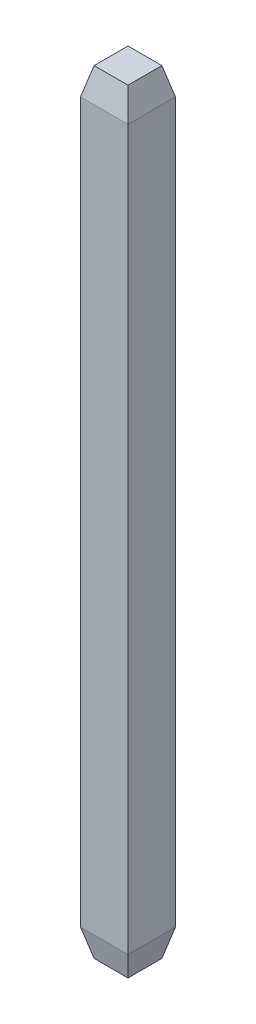
ISO-10303-21;
HEADER;
FILE_DESCRIPTION(('STEP AP214'),'2;1');
FILE_NAME('part.step','',(''),(''),'','','');
FILE_SCHEMA(('AUTOMOTIVE_DESIGN { 1 0 10303 214 1 1 1 1 }'));
ENDSEC;
DATA;
#1=APPLICATION_CONTEXT('core data for automotive mechanical design processes');
#2=APPLICATION_PROTOCOL_DEFINITION('international standard','automotive_design',2000,#1);
#3=PRODUCT_CONTEXT('',#1,'mechanical');
#4=PRODUCT('Part','Part','',(#3));
#5=PRODUCT_RELATED_PRODUCT_CATEGORY('part','',(#4));
#6=PRODUCT_DEFINITION_FORMATION('','',#4);
#7=PRODUCT_DEFINITION_CONTEXT('part definition',#1,'design');
#8=PRODUCT_DEFINITION('design','',#6,#7);
#9=PRODUCT_DEFINITION_SHAPE('','',#8);
#10=(LENGTH_UNIT() NAMED_UNIT(*) SI_UNIT(.MILLI.,.METRE.));
#11=(NAMED_UNIT(*) PLANE_ANGLE_UNIT() SI_UNIT($,.RADIAN.));
#12=(NAMED_UNIT(*) SI_UNIT($,.STERADIAN.) SOLID_ANGLE_UNIT());
#13=UNCERTAINTY_MEASURE_WITH_UNIT(LENGTH_MEASURE(1.E-05),#10,'distance_accuracy_value','');
#14=(GEOMETRIC_REPRESENTATION_CONTEXT(3) GLOBAL_UNCERTAINTY_ASSIGNED_CONTEXT((#13)) GLOBAL_UNIT_ASSIGNED_CONTEXT((#10,
#11,#12)) REPRESENTATION_CONTEXT('',''));
#15=CARTESIAN_POINT('',(0.,0.,0.));
#16=DIRECTION('',(0.,0.,1.));
#17=DIRECTION('',(1.,0.,0.));
#18=AXIS2_PLACEMENT_3D('',#15,#16,#17);
#19=CARTESIAN_POINT('',(0.25,11.4,0.));
#20=DIRECTION('',(-0.970142500145391,-0.242535625036098,0.));
#21=DIRECTION('',(0.242535625036098,-0.970142500145391,0.));
#22=AXIS2_PLACEMENT_3D('',#19,#20,#21);
#23=PLANE('',#22);
#24=DIRECTION('',(0.,0.,1.));
#25=VECTOR('',#24,1.);
#26=CARTESIAN_POINT('',(0.35,11.,0.35));
#27=LINE('',#26,#25);
#28=CARTESIAN_POINT('',(0.349999999999952,11.,0.349999999999976));
#29=VERTEX_POINT('',#28);
#30=CARTESIAN_POINT('',(0.349999999999952,11.,-0.349999999999976));
#31=VERTEX_POINT('',#30);
#32=EDGE_CURVE('E119',#29,#31,#27,.F.);
#33=ORIENTED_EDGE('',*,*,#32,.T.);
#34=DIRECTION('',(-0.235702260395515,0.942809041582121,0.235702260395287));
#35=VECTOR('',#34,1.);
#36=CARTESIAN_POINT('',(0.35,11.,-0.349999999999903));
#37=LINE('',#36,#35);
#38=CARTESIAN_POINT('',(0.25,11.4,-0.25));
#39=VERTEX_POINT('',#38);
#40=EDGE_CURVE('E90',#31,#39,#37,.T.);
#41=ORIENTED_EDGE('',*,*,#40,.T.);
#42=DIRECTION('',(0.,0.,-1.));
#43=VECTOR('',#42,1.);
#44=CARTESIAN_POINT('',(0.25,11.4,0.));
#45=LINE('',#44,#43);
#46=CARTESIAN_POINT('',(0.25,11.4,0.25));
#47=VERTEX_POINT('',#46);
#48=EDGE_CURVE('E20',#39,#47,#45,.F.);
#49=ORIENTED_EDGE('',*,*,#48,.T.);
#50=DIRECTION('',(0.235702260395515,-0.942809041582121,0.235702260395287));
#51=VECTOR('',#50,1.);
#52=CARTESIAN_POINT('',(0.25,11.4,0.25));
#53=LINE('',#52,#51);
#54=EDGE_CURVE('E88',#47,#29,#53,.T.);
#55=ORIENTED_EDGE('',*,*,#54,.T.);
#56=EDGE_LOOP('',(#33,#41,#49,#55));
#57=FACE_BOUND('',#56,.T.);
#58=ADVANCED_FACE('F17',(#57),#23,.F.);
#59=CARTESIAN_POINT('',(0.35,0.4,0.35));
#60=DIRECTION('',(0.970142500145391,-0.242535625036098,0.));
#61=DIRECTION('',(0.242535625036098,0.970142500145391,0.));
#62=AXIS2_PLACEMENT_3D('',#59,#60,#61);
#63=PLANE('',#62);
#64=DIRECTION('',(0.235702260395516,0.942809041582121,0.235702260395287));
#65=VECTOR('',#64,1.);
#66=CARTESIAN_POINT('',(0.25,0.,0.250000000000097));
#67=LINE('',#66,#65);
#68=CARTESIAN_POINT('',(0.250000000000024,0.,0.250000000000024));
#69=VERTEX_POINT('',#68);
#70=CARTESIAN_POINT('',(0.35,0.4,0.35));
#71=VERTEX_POINT('',#70);
#72=EDGE_CURVE('E110',#69,#71,#67,.T.);
#73=ORIENTED_EDGE('',*,*,#72,.F.);
#74=DIRECTION('',(0.,0.,-1.));
#75=VECTOR('',#74,1.);
#76=CARTESIAN_POINT('',(0.25,0.,0.));
#77=LINE('',#76,#75);
#78=CARTESIAN_POINT('',(0.250000000000049,0.,-0.250000000000024));
#79=VERTEX_POINT('',#78);
#80=EDGE_CURVE('E80',#79,#69,#77,.F.);
#81=ORIENTED_EDGE('',*,*,#80,.F.);
#82=DIRECTION('',(-0.235702260395516,-0.942809041582121,0.235702260395287));
#83=VECTOR('',#82,1.);
#84=CARTESIAN_POINT('',(0.35,0.4,-0.35));
#85=LINE('',#84,#83);
#86=CARTESIAN_POINT('',(0.35,0.4,-0.35));
#87=VERTEX_POINT('',#86);
#88=EDGE_CURVE('E115',#87,#79,#85,.T.);
#89=ORIENTED_EDGE('',*,*,#88,.F.);
#90=DIRECTION('',(0.,0.,1.));
#91=VECTOR('',#90,1.);
#92=CARTESIAN_POINT('',(0.35,0.399999999999999,0.35));
#93=LINE('',#92,#91);
#94=EDGE_CURVE('E121',#87,#71,#93,.T.);
#95=ORIENTED_EDGE('',*,*,#94,.T.);
#96=EDGE_LOOP('',(#73,#81,#89,#95));
#97=FACE_BOUND('',#96,.T.);
#98=ADVANCED_FACE('F211',(#97),#63,.T.);
#99=CARTESIAN_POINT('',(0.,11.4,0.));
#100=DIRECTION('',(0.,-1.,0.));
#101=DIRECTION('',(0.,0.,-1.));
#102=AXIS2_PLACEMENT_3D('',#99,#100,#101);
#103=PLANE('',#102);
#104=DIRECTION('',(1.,0.,0.));
#105=VECTOR('',#104,1.);
#106=CARTESIAN_POINT('',(0.,11.4,-0.25));
#107=LINE('',#106,#105);
#108=CARTESIAN_POINT('',(-0.25,11.4,-0.25));
#109=VERTEX_POINT('',#108);
#110=EDGE_CURVE('E112',#39,#109,#107,.F.);
#111=ORIENTED_EDGE('',*,*,#110,.T.);
#112=DIRECTION('',(0.,0.,1.));
#113=VECTOR('',#112,1.);
#114=CARTESIAN_POINT('',(-0.25,11.4,0.));
#115=LINE('',#114,#113);
#116=CARTESIAN_POINT('',(-0.25,11.4,0.25));
#117=VERTEX_POINT('',#116);
#118=EDGE_CURVE('E105',#109,#117,#115,.T.);
#119=ORIENTED_EDGE('',*,*,#118,.T.);
#120=DIRECTION('',(1.,0.,0.));
#121=VECTOR('',#120,1.);
#122=CARTESIAN_POINT('',(0.,11.4,0.25));
#123=LINE('',#122,#121);
#124=EDGE_CURVE('E94',#117,#47,#123,.T.);
#125=ORIENTED_EDGE('',*,*,#124,.T.);
#126=ORIENTED_EDGE('',*,*,#48,.F.);
#127=EDGE_LOOP('',(#111,#119,#125,#126));
#128=FACE_BOUND('',#127,.T.);
#129=ADVANCED_FACE('F103',(#128),#103,.F.);
#130=CARTESIAN_POINT('',(0.,11.4,0.25));
#131=DIRECTION('',(0.,-0.242535625036098,-0.970142500145391));
#132=DIRECTION('',(0.,0.970142500145391,-0.242535625036098));
#133=AXIS2_PLACEMENT_3D('',#130,#131,#132);
#134=PLANE('',#133);
#135=DIRECTION('',(-1.,0.,0.));
#136=VECTOR('',#135,1.);
#137=CARTESIAN_POINT('',(-0.35,11.,0.35));
#138=LINE('',#137,#136);
#139=CARTESIAN_POINT('',(-0.349999999999976,11.,0.349999999999952));
#140=VERTEX_POINT('',#139);
#141=EDGE_CURVE('E100',#140,#29,#138,.F.);
#142=ORIENTED_EDGE('',*,*,#141,.T.);
#143=ORIENTED_EDGE('',*,*,#54,.F.);
#144=ORIENTED_EDGE('',*,*,#124,.F.);
#145=DIRECTION('',(-0.235702260395287,-0.942809041582121,0.235702260395515));
#146=VECTOR('',#145,1.);
#147=CARTESIAN_POINT('',(-0.25,11.4,0.25));
#148=LINE('',#147,#146);
#149=EDGE_CURVE('E128',#117,#140,#148,.T.);
#150=ORIENTED_EDGE('',*,*,#149,.T.);
#151=EDGE_LOOP('',(#142,#143,#144,#150));
#152=FACE_BOUND('',#151,.T.);
#153=ADVANCED_FACE('F97',(#152),#134,.F.);
#154=CARTESIAN_POINT('',(0.,0.,0.));
#155=DIRECTION('',(0.,-1.,0.));
#156=DIRECTION('',(0.,0.,-1.));
#157=AXIS2_PLACEMENT_3D('',#154,#155,#156);
#158=PLANE('',#157);
#159=DIRECTION('',(0.,0.,1.));
#160=VECTOR('',#159,1.);
#161=CARTESIAN_POINT('',(-0.250000000000097,0.,0.35));
#162=LINE('',#161,#160);
#163=CARTESIAN_POINT('',(-0.250000000000024,0.,-0.250000000000049));
#164=VERTEX_POINT('',#163);
#165=CARTESIAN_POINT('',(-0.250000000000024,0.,0.250000000000024));
#166=VERTEX_POINT('',#165);
#167=EDGE_CURVE('E140',#164,#166,#162,.T.);
#168=ORIENTED_EDGE('',*,*,#167,.F.);
#169=DIRECTION('',(1.,0.,0.));
#170=VECTOR('',#169,1.);
#171=CARTESIAN_POINT('',(-0.35,0.,-0.250000000000097));
#172=LINE('',#171,#170);
#173=EDGE_CURVE('E117',#79,#164,#172,.F.);
#174=ORIENTED_EDGE('',*,*,#173,.F.);
#175=ORIENTED_EDGE('',*,*,#80,.T.);
#176=DIRECTION('',(1.,0.,0.));
#177=VECTOR('',#176,1.);
#178=CARTESIAN_POINT('',(-0.35,0.,0.250000000000097));
#179=LINE('',#178,#177);
#180=EDGE_CURVE('E108',#166,#69,#179,.T.);
#181=ORIENTED_EDGE('',*,*,#180,.F.);
#182=EDGE_LOOP('',(#168,#174,#175,#181));
#183=FACE_BOUND('',#182,.T.);
#184=ADVANCED_FACE('F204',(#183),#158,.T.);
#185=CARTESIAN_POINT('',(-0.35,0.4,0.35));
#186=DIRECTION('',(0.,-0.242535625036098,0.970142500145391));
#187=DIRECTION('',(0.,-0.970142500145391,-0.242535625036098));
#188=AXIS2_PLACEMENT_3D('',#185,#186,#187);
#189=PLANE('',#188);
#190=ORIENTED_EDGE('',*,*,#72,.T.);
#191=DIRECTION('',(-1.,0.,0.));
#192=VECTOR('',#191,1.);
#193=CARTESIAN_POINT('',(-0.35,0.399999999999999,0.35));
#194=LINE('',#193,#192);
#195=CARTESIAN_POINT('',(-0.35,0.4,0.35));
#196=VERTEX_POINT('',#195);
#197=EDGE_CURVE('E134',#71,#196,#194,.T.);
#198=ORIENTED_EDGE('',*,*,#197,.T.);
#199=DIRECTION('',(-0.235702260395287,0.94280904158212,0.235702260395516));
#200=VECTOR('',#199,1.);
#201=CARTESIAN_POINT('',(-0.250000000000097,0.,0.25));
#202=LINE('',#201,#200);
#203=EDGE_CURVE('E142',#166,#196,#202,.T.);
#204=ORIENTED_EDGE('',*,*,#203,.F.);
#205=ORIENTED_EDGE('',*,*,#180,.T.);
#206=EDGE_LOOP('',(#190,#198,#204,#205));
#207=FACE_BOUND('',#206,.T.);
#208=ADVANCED_FACE('F201',(#207),#189,.T.);
#209=CARTESIAN_POINT('',(0.,11.4,-0.25));
#210=DIRECTION('',(0.,-0.242535625036098,0.970142500145391));
#211=DIRECTION('',(0.,-0.970142500145391,-0.242535625036098));
#212=AXIS2_PLACEMENT_3D('',#209,#210,#211);
#213=PLANE('',#212);
#214=DIRECTION('',(1.,0.,0.));
#215=VECTOR('',#214,1.);
#216=CARTESIAN_POINT('',(-0.35,11.,-0.35));
#217=LINE('',#216,#215);
#218=CARTESIAN_POINT('',(-0.349999999999976,11.,-0.349999999999952));
#219=VERTEX_POINT('',#218);
#220=EDGE_CURVE('E144',#31,#219,#217,.F.);
#221=ORIENTED_EDGE('',*,*,#220,.T.);
#222=DIRECTION('',(0.235702260395287,0.942809041582121,0.235702260395515));
#223=VECTOR('',#222,1.);
#224=CARTESIAN_POINT('',(-0.349999999999903,11.,-0.35));
#225=LINE('',#224,#223);
#226=EDGE_CURVE('E124',#219,#109,#225,.T.);
#227=ORIENTED_EDGE('',*,*,#226,.T.);
#228=ORIENTED_EDGE('',*,*,#110,.F.);
#229=ORIENTED_EDGE('',*,*,#40,.F.);
#230=EDGE_LOOP('',(#221,#227,#228,#229));
#231=FACE_BOUND('',#230,.T.);
#232=ADVANCED_FACE('F175',(#231),#213,.F.);
#233=CARTESIAN_POINT('',(-0.35,0.4,-0.35));
#234=DIRECTION('',(0.,-0.242535625036098,-0.970142500145391));
#235=DIRECTION('',(0.,0.970142500145391,-0.242535625036098));
#236=AXIS2_PLACEMENT_3D('',#233,#234,#235);
#237=PLANE('',#236);
#238=DIRECTION('',(0.235702260395287,-0.942809041582121,0.235702260395516));
#239=VECTOR('',#238,1.);
#240=CARTESIAN_POINT('',(-0.35,0.4,-0.35));
#241=LINE('',#240,#239);
#242=CARTESIAN_POINT('',(-0.35,0.4,-0.35));
#243=VERTEX_POINT('',#242);
#244=EDGE_CURVE('E137',#243,#164,#241,.T.);
#245=ORIENTED_EDGE('',*,*,#244,.F.);
#246=DIRECTION('',(1.,0.,0.));
#247=VECTOR('',#246,1.);
#248=CARTESIAN_POINT('',(-0.35,0.399999999999999,-0.35));
#249=LINE('',#248,#247);
#250=EDGE_CURVE('E34',#243,#87,#249,.T.);
#251=ORIENTED_EDGE('',*,*,#250,.T.);
#252=ORIENTED_EDGE('',*,*,#88,.T.);
#253=ORIENTED_EDGE('',*,*,#173,.T.);
#254=EDGE_LOOP('',(#245,#251,#252,#253));
#255=FACE_BOUND('',#254,.T.);
#256=ADVANCED_FACE('F194',(#255),#237,.T.);
#257=CARTESIAN_POINT('',(0.35,11.4,0.35));
#258=DIRECTION('',(-1.,0.,0.));
#259=DIRECTION('',(0.,0.,1.));
#260=AXIS2_PLACEMENT_3D('',#257,#258,#259);
#261=PLANE('',#260);
#262=ORIENTED_EDGE('',*,*,#94,.F.);
#263=DIRECTION('',(0.,1.,0.));
#264=VECTOR('',#263,1.);
#265=CARTESIAN_POINT('',(0.35,11.4,-0.35));
#266=LINE('',#265,#264);
#267=EDGE_CURVE('E148',#87,#31,#266,.T.);
#268=ORIENTED_EDGE('',*,*,#267,.T.);
#269=ORIENTED_EDGE('',*,*,#32,.F.);
#270=DIRECTION('',(0.,1.,0.));
#271=VECTOR('',#270,1.);
#272=CARTESIAN_POINT('',(0.35,11.4,0.35));
#273=LINE('',#272,#271);
#274=EDGE_CURVE('E131',#29,#71,#273,.F.);
#275=ORIENTED_EDGE('',*,*,#274,.T.);
#276=EDGE_LOOP('',(#262,#268,#269,#275));
#277=FACE_BOUND('',#276,.T.);
#278=ADVANCED_FACE('F191',(#277),#261,.F.);
#279=CARTESIAN_POINT('',(-0.25,11.4,0.));
#280=DIRECTION('',(0.970142500145391,-0.242535625036098,0.));
#281=DIRECTION('',(0.242535625036098,0.970142500145391,0.));
#282=AXIS2_PLACEMENT_3D('',#279,#280,#281);
#283=PLANE('',#282);
#284=ORIENTED_EDGE('',*,*,#118,.F.);
#285=ORIENTED_EDGE('',*,*,#226,.F.);
#286=DIRECTION('',(0.,0.,-1.));
#287=VECTOR('',#286,1.);
#288=CARTESIAN_POINT('',(-0.35,11.,0.35));
#289=LINE('',#288,#287);
#290=EDGE_CURVE('E151',#219,#140,#289,.F.);
#291=ORIENTED_EDGE('',*,*,#290,.T.);
#292=ORIENTED_EDGE('',*,*,#149,.F.);
#293=EDGE_LOOP('',(#284,#285,#291,#292));
#294=FACE_BOUND('',#293,.T.);
#295=ADVANCED_FACE('F172',(#294),#283,.F.);
#296=CARTESIAN_POINT('',(-0.35,11.4,0.35));
#297=DIRECTION('',(0.,0.,-1.));
#298=DIRECTION('',(-1.,0.,0.));
#299=AXIS2_PLACEMENT_3D('',#296,#297,#298);
#300=PLANE('',#299);
#301=ORIENTED_EDGE('',*,*,#197,.F.);
#302=ORIENTED_EDGE('',*,*,#274,.F.);
#303=ORIENTED_EDGE('',*,*,#141,.F.);
#304=DIRECTION('',(0.,1.,0.));
#305=VECTOR('',#304,1.);
#306=CARTESIAN_POINT('',(-0.35,11.4,0.35));
#307=LINE('',#306,#305);
#308=EDGE_CURVE('E154',#140,#196,#307,.F.);
#309=ORIENTED_EDGE('',*,*,#308,.T.);
#310=EDGE_LOOP('',(#301,#302,#303,#309));
#311=FACE_BOUND('',#310,.T.);
#312=ADVANCED_FACE('F170',(#311),#300,.F.);
#313=CARTESIAN_POINT('',(-0.35,0.4,0.35));
#314=DIRECTION('',(-0.970142500145391,-0.242535625036098,0.));
#315=DIRECTION('',(0.242535625036098,-0.970142500145391,0.));
#316=AXIS2_PLACEMENT_3D('',#313,#314,#315);
#317=PLANE('',#316);
#318=ORIENTED_EDGE('',*,*,#203,.T.);
#319=DIRECTION('',(0.,0.,-1.));
#320=VECTOR('',#319,1.);
#321=CARTESIAN_POINT('',(-0.35,0.399999999999999,0.35));
#322=LINE('',#321,#320);
#323=EDGE_CURVE('E26',#196,#243,#322,.T.);
#324=ORIENTED_EDGE('',*,*,#323,.T.);
#325=ORIENTED_EDGE('',*,*,#244,.T.);
#326=ORIENTED_EDGE('',*,*,#167,.T.);
#327=EDGE_LOOP('',(#318,#324,#325,#326));
#328=FACE_BOUND('',#327,.T.);
#329=ADVANCED_FACE('F160',(#328),#317,.T.);
#330=CARTESIAN_POINT('',(-0.35,11.4,-0.35));
#331=DIRECTION('',(0.,0.,1.));
#332=DIRECTION('',(1.,0.,0.));
#333=AXIS2_PLACEMENT_3D('',#330,#331,#332);
#334=PLANE('',#333);
#335=ORIENTED_EDGE('',*,*,#250,.F.);
#336=DIRECTION('',(0.,1.,0.));
#337=VECTOR('',#336,1.);
#338=CARTESIAN_POINT('',(-0.35,11.4,-0.35));
#339=LINE('',#338,#337);
#340=EDGE_CURVE('E11',#243,#219,#339,.T.);
#341=ORIENTED_EDGE('',*,*,#340,.T.);
#342=ORIENTED_EDGE('',*,*,#220,.F.);
#343=ORIENTED_EDGE('',*,*,#267,.F.);
#344=EDGE_LOOP('',(#335,#341,#342,#343));
#345=FACE_BOUND('',#344,.T.);
#346=ADVANCED_FACE('F176',(#345),#334,.F.);
#347=CARTESIAN_POINT('',(-0.35,11.4,0.35));
#348=DIRECTION('',(1.,0.,0.));
#349=DIRECTION('',(0.,0.,-1.));
#350=AXIS2_PLACEMENT_3D('',#347,#348,#349);
#351=PLANE('',#350);
#352=ORIENTED_EDGE('',*,*,#323,.F.);
#353=ORIENTED_EDGE('',*,*,#308,.F.);
#354=ORIENTED_EDGE('',*,*,#290,.F.);
#355=ORIENTED_EDGE('',*,*,#340,.F.);
#356=EDGE_LOOP('',(#352,#353,#354,#355));
#357=FACE_BOUND('',#356,.T.);
#358=ADVANCED_FACE('F166',(#357),#351,.F.);
#359=CLOSED_SHELL('',(#58,#98,#129,#153,#184,#208,#232,#256,#278,#295,#312,#329,#346,#358));
#360=MANIFOLD_SOLID_BREP('B1',#359);
#361=ADVANCED_BREP_SHAPE_REPRESENTATION('',(#18,#360),#14);
#362=SHAPE_DEFINITION_REPRESENTATION(#9,#361);
ENDSEC;
END-ISO-10303-21;
